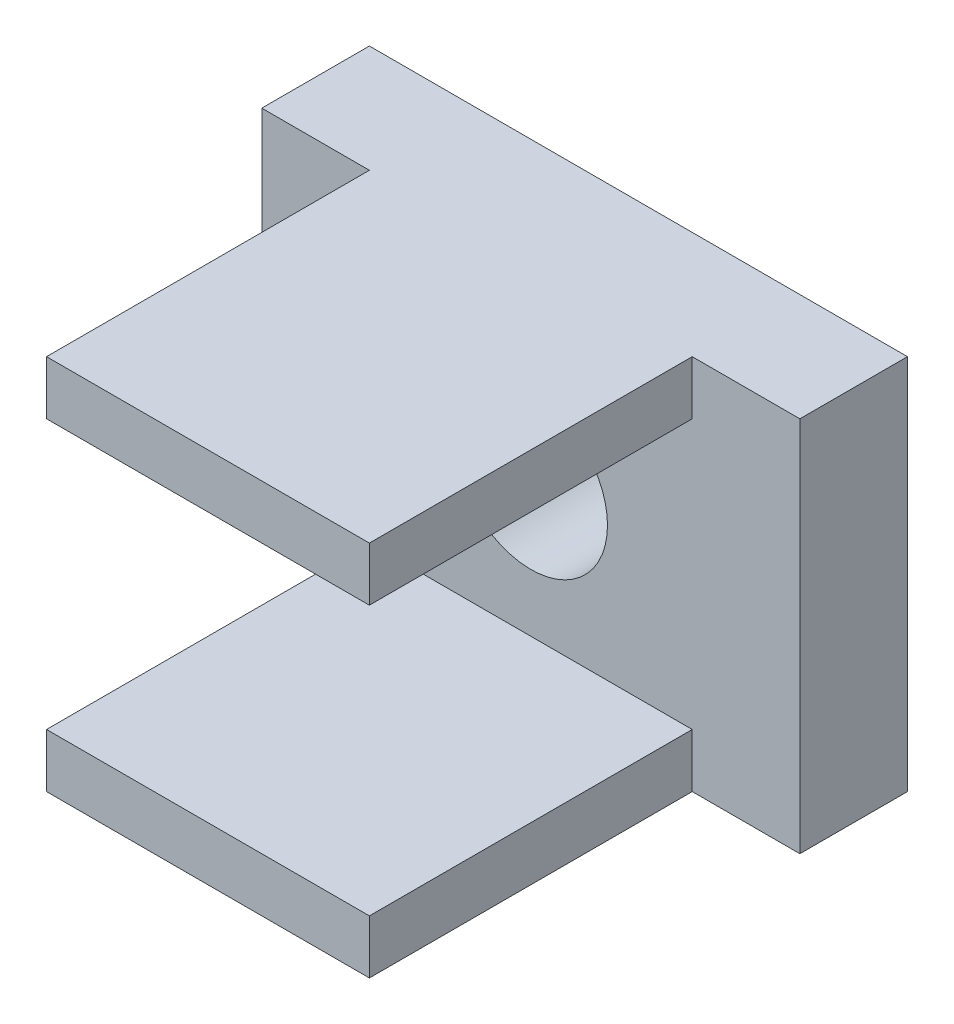
ISO-10303-21;
HEADER;
FILE_DESCRIPTION(('STEP AP214'),'2;1');
FILE_NAME('part.step','',(''),(''),'','','');
FILE_SCHEMA(('AUTOMOTIVE_DESIGN { 1 0 10303 214 1 1 1 1 }'));
ENDSEC;
DATA;
#1=APPLICATION_CONTEXT('core data for automotive mechanical design processes');
#2=APPLICATION_PROTOCOL_DEFINITION('international standard','automotive_design',2000,#1);
#3=PRODUCT_CONTEXT('',#1,'mechanical');
#4=PRODUCT('Part','Part','',(#3));
#5=PRODUCT_RELATED_PRODUCT_CATEGORY('part','',(#4));
#6=PRODUCT_DEFINITION_FORMATION('','',#4);
#7=PRODUCT_DEFINITION_CONTEXT('part definition',#1,'design');
#8=PRODUCT_DEFINITION('design','',#6,#7);
#9=PRODUCT_DEFINITION_SHAPE('','',#8);
#10=(LENGTH_UNIT() NAMED_UNIT(*) SI_UNIT(.MILLI.,.METRE.));
#11=(NAMED_UNIT(*) PLANE_ANGLE_UNIT() SI_UNIT($,.RADIAN.));
#12=(NAMED_UNIT(*) SI_UNIT($,.STERADIAN.) SOLID_ANGLE_UNIT());
#13=UNCERTAINTY_MEASURE_WITH_UNIT(LENGTH_MEASURE(1.E-05),#10,'distance_accuracy_value','');
#14=(GEOMETRIC_REPRESENTATION_CONTEXT(3) GLOBAL_UNCERTAINTY_ASSIGNED_CONTEXT((#13)) GLOBAL_UNIT_ASSIGNED_CONTEXT((#10,
#11,#12)) REPRESENTATION_CONTEXT('',''));
#15=CARTESIAN_POINT('',(0.,0.,0.));
#16=DIRECTION('',(0.,0.,1.));
#17=DIRECTION('',(1.,0.,0.));
#18=AXIS2_PLACEMENT_3D('',#15,#16,#17);
#19=CARTESIAN_POINT('',(0.,0.,2.));
#20=DIRECTION('',(0.,0.,1.));
#21=DIRECTION('',(1.,0.,0.));
#22=AXIS2_PLACEMENT_3D('',#19,#20,#21);
#23=PLANE('',#22);
#24=CARTESIAN_POINT('',(0.,0.,2.));
#25=DIRECTION('',(0.,0.,1.));
#26=DIRECTION('',(1.,0.,0.));
#27=AXIS2_PLACEMENT_3D('',#24,#25,#26);
#28=CIRCLE('',#27,1.425);
#29=CARTESIAN_POINT('',(1.425,0.,2.));
#30=VERTEX_POINT('',#29);
#31=EDGE_CURVE('E412',#30,#30,#28,.T.);
#32=ORIENTED_EDGE('',*,*,#31,.F.);
#33=EDGE_LOOP('',(#32));
#34=FACE_BOUND('',#33,.T.);
#35=DIRECTION('',(1.,0.,0.));
#36=VECTOR('',#35,1.);
#37=CARTESIAN_POINT('',(-5.,-3.5,2.));
#38=LINE('',#37,#36);
#39=CARTESIAN_POINT('',(-5.,-3.5,2.));
#40=VERTEX_POINT('',#39);
#41=CARTESIAN_POINT('',(-3.,-3.5,2.));
#42=VERTEX_POINT('',#41);
#43=EDGE_CURVE('E215',#40,#42,#38,.T.);
#44=ORIENTED_EDGE('',*,*,#43,.T.);
#45=DIRECTION('',(0.,-1.,0.));
#46=VECTOR('',#45,1.);
#47=CARTESIAN_POINT('',(-3.,-3.5,2.));
#48=LINE('',#47,#46);
#49=CARTESIAN_POINT('',(-3.,-2.5,2.));
#50=VERTEX_POINT('',#49);
#51=EDGE_CURVE('E155',#50,#42,#48,.T.);
#52=ORIENTED_EDGE('',*,*,#51,.F.);
#53=DIRECTION('',(-1.,0.,0.));
#54=VECTOR('',#53,1.);
#55=CARTESIAN_POINT('',(-3.,-2.5,2.));
#56=LINE('',#55,#54);
#57=CARTESIAN_POINT('',(3.,-2.5,2.));
#58=VERTEX_POINT('',#57);
#59=EDGE_CURVE('E151',#58,#50,#56,.T.);
#60=ORIENTED_EDGE('',*,*,#59,.F.);
#61=DIRECTION('',(0.,1.,0.));
#62=VECTOR('',#61,1.);
#63=CARTESIAN_POINT('',(3.,-3.5,2.));
#64=LINE('',#63,#62);
#65=CARTESIAN_POINT('',(3.,-3.5,2.));
#66=VERTEX_POINT('',#65);
#67=EDGE_CURVE('E256',#66,#58,#64,.T.);
#68=ORIENTED_EDGE('',*,*,#67,.F.);
#69=CARTESIAN_POINT('',(5.,-3.5,2.));
#70=VERTEX_POINT('',#69);
#71=EDGE_CURVE('E214',#66,#70,#38,.T.);
#72=ORIENTED_EDGE('',*,*,#71,.T.);
#73=DIRECTION('',(0.,1.,0.));
#74=VECTOR('',#73,1.);
#75=CARTESIAN_POINT('',(5.,3.5,2.));
#76=LINE('',#75,#74);
#77=CARTESIAN_POINT('',(5.,3.5,2.));
#78=VERTEX_POINT('',#77);
#79=EDGE_CURVE('E202',#70,#78,#76,.T.);
#80=ORIENTED_EDGE('',*,*,#79,.T.);
#81=DIRECTION('',(-1.,0.,0.));
#82=VECTOR('',#81,1.);
#83=CARTESIAN_POINT('',(-5.,3.5,2.));
#84=LINE('',#83,#82);
#85=CARTESIAN_POINT('',(3.,3.5,2.));
#86=VERTEX_POINT('',#85);
#87=EDGE_CURVE('E208',#78,#86,#84,.T.);
#88=ORIENTED_EDGE('',*,*,#87,.T.);
#89=DIRECTION('',(0.,1.,0.));
#90=VECTOR('',#89,1.);
#91=CARTESIAN_POINT('',(3.,3.5,2.));
#92=LINE('',#91,#90);
#93=CARTESIAN_POINT('',(3.,2.5,2.));
#94=VERTEX_POINT('',#93);
#95=EDGE_CURVE('E172',#94,#86,#92,.T.);
#96=ORIENTED_EDGE('',*,*,#95,.F.);
#97=DIRECTION('',(1.,0.,0.));
#98=VECTOR('',#97,1.);
#99=CARTESIAN_POINT('',(-3.,2.5,2.));
#100=LINE('',#99,#98);
#101=CARTESIAN_POINT('',(-3.,2.5,2.));
#102=VERTEX_POINT('',#101);
#103=EDGE_CURVE('E63',#102,#94,#100,.T.);
#104=ORIENTED_EDGE('',*,*,#103,.F.);
#105=DIRECTION('',(0.,-1.,0.));
#106=VECTOR('',#105,1.);
#107=CARTESIAN_POINT('',(-3.,3.5,2.));
#108=LINE('',#107,#106);
#109=CARTESIAN_POINT('',(-3.,3.5,2.));
#110=VERTEX_POINT('',#109);
#111=EDGE_CURVE('E158',#110,#102,#108,.T.);
#112=ORIENTED_EDGE('',*,*,#111,.F.);
#113=CARTESIAN_POINT('',(-5.,3.5,2.));
#114=VERTEX_POINT('',#113);
#115=EDGE_CURVE('E206',#110,#114,#84,.T.);
#116=ORIENTED_EDGE('',*,*,#115,.T.);
#117=DIRECTION('',(0.,-1.,0.));
#118=VECTOR('',#117,1.);
#119=CARTESIAN_POINT('',(-5.,3.5,2.));
#120=LINE('',#119,#118);
#121=EDGE_CURVE('E211',#114,#40,#120,.T.);
#122=ORIENTED_EDGE('',*,*,#121,.T.);
#123=EDGE_LOOP('',(#44,#52,#60,#68,#72,#80,#88,#96,#104,#112,#116,#122));
#124=FACE_BOUND('',#123,.T.);
#125=ADVANCED_FACE('F39',(#34,#124),#23,.T.);
#126=CARTESIAN_POINT('',(5.,3.5,2.));
#127=DIRECTION('',(-1.,0.,0.));
#128=DIRECTION('',(0.,-1.,0.));
#129=AXIS2_PLACEMENT_3D('',#126,#127,#128);
#130=PLANE('',#129);
#131=DIRECTION('',(0.,1.,0.));
#132=VECTOR('',#131,1.);
#133=CARTESIAN_POINT('',(5.,3.5,0.));
#134=LINE('',#133,#132);
#135=CARTESIAN_POINT('',(5.,-3.5,0.));
#136=VERTEX_POINT('',#135);
#137=CARTESIAN_POINT('',(5.,3.5,0.));
#138=VERTEX_POINT('',#137);
#139=EDGE_CURVE('E201',#136,#138,#134,.T.);
#140=ORIENTED_EDGE('',*,*,#139,.T.);
#141=DIRECTION('',(0.,0.,-1.));
#142=VECTOR('',#141,1.);
#143=CARTESIAN_POINT('',(5.,3.5,2.));
#144=LINE('',#143,#142);
#145=EDGE_CURVE('E11',#78,#138,#144,.T.);
#146=ORIENTED_EDGE('',*,*,#145,.F.);
#147=ORIENTED_EDGE('',*,*,#79,.F.);
#148=DIRECTION('',(0.,0.,-1.));
#149=VECTOR('',#148,1.);
#150=CARTESIAN_POINT('',(5.,-3.5,2.));
#151=LINE('',#150,#149);
#152=EDGE_CURVE('E218',#70,#136,#151,.T.);
#153=ORIENTED_EDGE('',*,*,#152,.T.);
#154=EDGE_LOOP('',(#140,#146,#147,#153));
#155=FACE_BOUND('',#154,.T.);
#156=ADVANCED_FACE('F41',(#155),#130,.F.);
#157=CARTESIAN_POINT('',(-5.,3.5,2.));
#158=DIRECTION('',(0.,-1.,0.));
#159=DIRECTION('',(0.,0.,-1.));
#160=AXIS2_PLACEMENT_3D('',#157,#158,#159);
#161=PLANE('',#160);
#162=DIRECTION('',(-1.,0.,0.));
#163=VECTOR('',#162,1.);
#164=CARTESIAN_POINT('',(-5.,3.5,0.));
#165=LINE('',#164,#163);
#166=CARTESIAN_POINT('',(-5.,3.5,0.));
#167=VERTEX_POINT('',#166);
#168=EDGE_CURVE('E222',#138,#167,#165,.T.);
#169=ORIENTED_EDGE('',*,*,#168,.T.);
#170=DIRECTION('',(0.,0.,-1.));
#171=VECTOR('',#170,1.);
#172=CARTESIAN_POINT('',(-5.,3.5,2.));
#173=LINE('',#172,#171);
#174=EDGE_CURVE('E48',#114,#167,#173,.T.);
#175=ORIENTED_EDGE('',*,*,#174,.F.);
#176=ORIENTED_EDGE('',*,*,#115,.F.);
#177=DIRECTION('',(0.,0.,-1.));
#178=VECTOR('',#177,1.);
#179=CARTESIAN_POINT('',(-3.,3.5,8.));
#180=LINE('',#179,#178);
#181=CARTESIAN_POINT('',(-3.,3.5,8.));
#182=VERTEX_POINT('',#181);
#183=EDGE_CURVE('E180',#182,#110,#180,.T.);
#184=ORIENTED_EDGE('',*,*,#183,.F.);
#185=DIRECTION('',(-1.,0.,0.));
#186=VECTOR('',#185,1.);
#187=CARTESIAN_POINT('',(-3.,3.5,8.));
#188=LINE('',#187,#186);
#189=CARTESIAN_POINT('',(3.,3.5,8.));
#190=VERTEX_POINT('',#189);
#191=EDGE_CURVE('E178',#190,#182,#188,.T.);
#192=ORIENTED_EDGE('',*,*,#191,.F.);
#193=DIRECTION('',(0.,0.,-1.));
#194=VECTOR('',#193,1.);
#195=CARTESIAN_POINT('',(3.,3.5,8.));
#196=LINE('',#195,#194);
#197=EDGE_CURVE('E190',#190,#86,#196,.T.);
#198=ORIENTED_EDGE('',*,*,#197,.T.);
#199=ORIENTED_EDGE('',*,*,#87,.F.);
#200=ORIENTED_EDGE('',*,*,#145,.T.);
#201=EDGE_LOOP('',(#169,#175,#176,#184,#192,#198,#199,#200));
#202=FACE_BOUND('',#201,.T.);
#203=ADVANCED_FACE('F260',(#202),#161,.F.);
#204=CARTESIAN_POINT('',(-5.,3.5,2.));
#205=DIRECTION('',(1.,0.,0.));
#206=DIRECTION('',(0.,1.,0.));
#207=AXIS2_PLACEMENT_3D('',#204,#205,#206);
#208=PLANE('',#207);
#209=DIRECTION('',(0.,-1.,0.));
#210=VECTOR('',#209,1.);
#211=CARTESIAN_POINT('',(-5.,3.5,0.));
#212=LINE('',#211,#210);
#213=CARTESIAN_POINT('',(-5.,-3.5,0.));
#214=VERTEX_POINT('',#213);
#215=EDGE_CURVE('E225',#167,#214,#212,.T.);
#216=ORIENTED_EDGE('',*,*,#215,.T.);
#217=DIRECTION('',(0.,0.,-1.));
#218=VECTOR('',#217,1.);
#219=CARTESIAN_POINT('',(-5.,-3.5,2.));
#220=LINE('',#219,#218);
#221=EDGE_CURVE('E233',#40,#214,#220,.T.);
#222=ORIENTED_EDGE('',*,*,#221,.F.);
#223=ORIENTED_EDGE('',*,*,#121,.F.);
#224=ORIENTED_EDGE('',*,*,#174,.T.);
#225=EDGE_LOOP('',(#216,#222,#223,#224));
#226=FACE_BOUND('',#225,.T.);
#227=ADVANCED_FACE('F242',(#226),#208,.F.);
#228=CARTESIAN_POINT('',(-5.,-3.5,2.));
#229=DIRECTION('',(0.,1.,0.));
#230=DIRECTION('',(0.,0.,1.));
#231=AXIS2_PLACEMENT_3D('',#228,#229,#230);
#232=PLANE('',#231);
#233=DIRECTION('',(1.,0.,0.));
#234=VECTOR('',#233,1.);
#235=CARTESIAN_POINT('',(-5.,-3.5,0.));
#236=LINE('',#235,#234);
#237=EDGE_CURVE('E207',#214,#136,#236,.T.);
#238=ORIENTED_EDGE('',*,*,#237,.T.);
#239=ORIENTED_EDGE('',*,*,#152,.F.);
#240=ORIENTED_EDGE('',*,*,#71,.F.);
#241=DIRECTION('',(0.,0.,-1.));
#242=VECTOR('',#241,1.);
#243=CARTESIAN_POINT('',(3.,-3.5,8.));
#244=LINE('',#243,#242);
#245=CARTESIAN_POINT('',(3.,-3.5,8.));
#246=VERTEX_POINT('',#245);
#247=EDGE_CURVE('E137',#246,#66,#244,.T.);
#248=ORIENTED_EDGE('',*,*,#247,.F.);
#249=DIRECTION('',(1.,0.,0.));
#250=VECTOR('',#249,1.);
#251=CARTESIAN_POINT('',(-3.,-3.5,8.));
#252=LINE('',#251,#250);
#253=CARTESIAN_POINT('',(-3.,-3.5,8.));
#254=VERTEX_POINT('',#253);
#255=EDGE_CURVE('E129',#254,#246,#252,.T.);
#256=ORIENTED_EDGE('',*,*,#255,.F.);
#257=DIRECTION('',(0.,0.,-1.));
#258=VECTOR('',#257,1.);
#259=CARTESIAN_POINT('',(-3.,-3.5,8.));
#260=LINE('',#259,#258);
#261=EDGE_CURVE('E134',#254,#42,#260,.T.);
#262=ORIENTED_EDGE('',*,*,#261,.T.);
#263=ORIENTED_EDGE('',*,*,#43,.F.);
#264=ORIENTED_EDGE('',*,*,#221,.T.);
#265=EDGE_LOOP('',(#238,#239,#240,#248,#256,#262,#263,#264));
#266=FACE_BOUND('',#265,.T.);
#267=ADVANCED_FACE('F131',(#266),#232,.F.);
#268=CARTESIAN_POINT('',(0.,0.,0.));
#269=DIRECTION('',(0.,0.,1.));
#270=DIRECTION('',(1.,0.,0.));
#271=AXIS2_PLACEMENT_3D('',#268,#269,#270);
#272=PLANE('',#271);
#273=CARTESIAN_POINT('',(0.,0.,0.));
#274=DIRECTION('',(0.,0.,1.));
#275=DIRECTION('',(1.,0.,0.));
#276=AXIS2_PLACEMENT_3D('',#273,#274,#275);
#277=CIRCLE('',#276,1.425);
#278=CARTESIAN_POINT('',(1.425,0.,0.));
#279=VERTEX_POINT('',#278);
#280=EDGE_CURVE('E410',#279,#279,#277,.T.);
#281=ORIENTED_EDGE('',*,*,#280,.T.);
#282=EDGE_LOOP('',(#281));
#283=FACE_BOUND('',#282,.T.);
#284=ORIENTED_EDGE('',*,*,#139,.F.);
#285=ORIENTED_EDGE('',*,*,#237,.F.);
#286=ORIENTED_EDGE('',*,*,#215,.F.);
#287=ORIENTED_EDGE('',*,*,#168,.F.);
#288=EDGE_LOOP('',(#284,#285,#286,#287));
#289=FACE_BOUND('',#288,.T.);
#290=ADVANCED_FACE('F249',(#283,#289),#272,.F.);
#291=CARTESIAN_POINT('',(-3.,3.5,8.));
#292=DIRECTION('',(1.,0.,0.));
#293=DIRECTION('',(0.,1.,0.));
#294=AXIS2_PLACEMENT_3D('',#291,#292,#293);
#295=PLANE('',#294);
#296=ORIENTED_EDGE('',*,*,#111,.T.);
#297=DIRECTION('',(0.,0.,-1.));
#298=VECTOR('',#297,1.);
#299=CARTESIAN_POINT('',(-3.,2.5,8.));
#300=LINE('',#299,#298);
#301=CARTESIAN_POINT('',(-3.,2.5,8.));
#302=VERTEX_POINT('',#301);
#303=EDGE_CURVE('E198',#302,#102,#300,.T.);
#304=ORIENTED_EDGE('',*,*,#303,.F.);
#305=DIRECTION('',(0.,-1.,0.));
#306=VECTOR('',#305,1.);
#307=CARTESIAN_POINT('',(-3.,3.5,8.));
#308=LINE('',#307,#306);
#309=EDGE_CURVE('E167',#182,#302,#308,.T.);
#310=ORIENTED_EDGE('',*,*,#309,.F.);
#311=ORIENTED_EDGE('',*,*,#183,.T.);
#312=EDGE_LOOP('',(#296,#304,#310,#311));
#313=FACE_BOUND('',#312,.T.);
#314=ADVANCED_FACE('F264',(#313),#295,.F.);
#315=CARTESIAN_POINT('',(-3.,2.5,8.));
#316=DIRECTION('',(0.,1.,0.));
#317=DIRECTION('',(0.,0.,1.));
#318=AXIS2_PLACEMENT_3D('',#315,#316,#317);
#319=PLANE('',#318);
#320=ORIENTED_EDGE('',*,*,#103,.T.);
#321=DIRECTION('',(0.,0.,-1.));
#322=VECTOR('',#321,1.);
#323=CARTESIAN_POINT('',(3.,2.5,8.));
#324=LINE('',#323,#322);
#325=CARTESIAN_POINT('',(3.,2.5,8.));
#326=VERTEX_POINT('',#325);
#327=EDGE_CURVE('E194',#326,#94,#324,.T.);
#328=ORIENTED_EDGE('',*,*,#327,.F.);
#329=DIRECTION('',(1.,0.,0.));
#330=VECTOR('',#329,1.);
#331=CARTESIAN_POINT('',(-3.,2.5,8.));
#332=LINE('',#331,#330);
#333=EDGE_CURVE('E171',#302,#326,#332,.T.);
#334=ORIENTED_EDGE('',*,*,#333,.F.);
#335=ORIENTED_EDGE('',*,*,#303,.T.);
#336=EDGE_LOOP('',(#320,#328,#334,#335));
#337=FACE_BOUND('',#336,.T.);
#338=ADVANCED_FACE('F274',(#337),#319,.F.);
#339=CARTESIAN_POINT('',(3.,3.5,8.));
#340=DIRECTION('',(-1.,0.,0.));
#341=DIRECTION('',(0.,-1.,0.));
#342=AXIS2_PLACEMENT_3D('',#339,#340,#341);
#343=PLANE('',#342);
#344=ORIENTED_EDGE('',*,*,#95,.T.);
#345=ORIENTED_EDGE('',*,*,#197,.F.);
#346=DIRECTION('',(0.,1.,0.));
#347=VECTOR('',#346,1.);
#348=CARTESIAN_POINT('',(3.,3.5,8.));
#349=LINE('',#348,#347);
#350=EDGE_CURVE('E175',#326,#190,#349,.T.);
#351=ORIENTED_EDGE('',*,*,#350,.F.);
#352=ORIENTED_EDGE('',*,*,#327,.T.);
#353=EDGE_LOOP('',(#344,#345,#351,#352));
#354=FACE_BOUND('',#353,.T.);
#355=ADVANCED_FACE('F272',(#354),#343,.F.);
#356=CARTESIAN_POINT('',(0.,0.,8.));
#357=DIRECTION('',(0.,0.,1.));
#358=DIRECTION('',(1.,0.,0.));
#359=AXIS2_PLACEMENT_3D('',#356,#357,#358);
#360=PLANE('',#359);
#361=ORIENTED_EDGE('',*,*,#309,.T.);
#362=ORIENTED_EDGE('',*,*,#333,.T.);
#363=ORIENTED_EDGE('',*,*,#350,.T.);
#364=ORIENTED_EDGE('',*,*,#191,.T.);
#365=EDGE_LOOP('',(#361,#362,#363,#364));
#366=FACE_BOUND('',#365,.T.);
#367=ADVANCED_FACE('F267',(#366),#360,.T.);
#368=CARTESIAN_POINT('',(-3.,-3.5,8.));
#369=DIRECTION('',(1.,0.,0.));
#370=DIRECTION('',(0.,1.,0.));
#371=AXIS2_PLACEMENT_3D('',#368,#369,#370);
#372=PLANE('',#371);
#373=ORIENTED_EDGE('',*,*,#51,.T.);
#374=ORIENTED_EDGE('',*,*,#261,.F.);
#375=DIRECTION('',(0.,-1.,0.));
#376=VECTOR('',#375,1.);
#377=CARTESIAN_POINT('',(-3.,-3.5,8.));
#378=LINE('',#377,#376);
#379=CARTESIAN_POINT('',(-3.,-2.5,8.));
#380=VERTEX_POINT('',#379);
#381=EDGE_CURVE('E142',#380,#254,#378,.T.);
#382=ORIENTED_EDGE('',*,*,#381,.F.);
#383=DIRECTION('',(0.,0.,-1.));
#384=VECTOR('',#383,1.);
#385=CARTESIAN_POINT('',(-3.,-2.5,8.));
#386=LINE('',#385,#384);
#387=EDGE_CURVE('E422',#380,#50,#386,.T.);
#388=ORIENTED_EDGE('',*,*,#387,.T.);
#389=EDGE_LOOP('',(#373,#374,#382,#388));
#390=FACE_BOUND('',#389,.T.);
#391=ADVANCED_FACE('F153',(#390),#372,.F.);
#392=CARTESIAN_POINT('',(3.,-3.5,8.));
#393=DIRECTION('',(-1.,0.,0.));
#394=DIRECTION('',(0.,-1.,0.));
#395=AXIS2_PLACEMENT_3D('',#392,#393,#394);
#396=PLANE('',#395);
#397=ORIENTED_EDGE('',*,*,#67,.T.);
#398=DIRECTION('',(0.,0.,-1.));
#399=VECTOR('',#398,1.);
#400=CARTESIAN_POINT('',(3.,-2.5,8.));
#401=LINE('',#400,#399);
#402=CARTESIAN_POINT('',(3.,-2.5,8.));
#403=VERTEX_POINT('',#402);
#404=EDGE_CURVE('E55',#403,#58,#401,.T.);
#405=ORIENTED_EDGE('',*,*,#404,.F.);
#406=DIRECTION('',(0.,1.,0.));
#407=VECTOR('',#406,1.);
#408=CARTESIAN_POINT('',(3.,-3.5,8.));
#409=LINE('',#408,#407);
#410=EDGE_CURVE('E141',#246,#403,#409,.T.);
#411=ORIENTED_EDGE('',*,*,#410,.F.);
#412=ORIENTED_EDGE('',*,*,#247,.T.);
#413=EDGE_LOOP('',(#397,#405,#411,#412));
#414=FACE_BOUND('',#413,.T.);
#415=ADVANCED_FACE('F340',(#414),#396,.F.);
#416=CARTESIAN_POINT('',(-3.,-2.5,8.));
#417=DIRECTION('',(0.,-1.,0.));
#418=DIRECTION('',(0.,0.,-1.));
#419=AXIS2_PLACEMENT_3D('',#416,#417,#418);
#420=PLANE('',#419);
#421=ORIENTED_EDGE('',*,*,#59,.T.);
#422=ORIENTED_EDGE('',*,*,#387,.F.);
#423=DIRECTION('',(-1.,0.,0.));
#424=VECTOR('',#423,1.);
#425=CARTESIAN_POINT('',(-3.,-2.5,8.));
#426=LINE('',#425,#424);
#427=EDGE_CURVE('E146',#403,#380,#426,.T.);
#428=ORIENTED_EDGE('',*,*,#427,.F.);
#429=ORIENTED_EDGE('',*,*,#404,.T.);
#430=EDGE_LOOP('',(#421,#422,#428,#429));
#431=FACE_BOUND('',#430,.T.);
#432=ADVANCED_FACE('F349',(#431),#420,.F.);
#433=CARTESIAN_POINT('',(0.,0.,8.));
#434=DIRECTION('',(0.,0.,-1.));
#435=DIRECTION('',(-1.,0.,0.));
#436=AXIS2_PLACEMENT_3D('',#433,#434,#435);
#437=PLANE('',#436);
#438=ORIENTED_EDGE('',*,*,#381,.T.);
#439=ORIENTED_EDGE('',*,*,#255,.T.);
#440=ORIENTED_EDGE('',*,*,#410,.T.);
#441=ORIENTED_EDGE('',*,*,#427,.T.);
#442=EDGE_LOOP('',(#438,#439,#440,#441));
#443=FACE_BOUND('',#442,.T.);
#444=ADVANCED_FACE('F145',(#443),#437,.F.);
#445=CARTESIAN_POINT('',(0.,0.,0.));
#446=DIRECTION('',(0.,0.,1.));
#447=DIRECTION('',(1.,0.,0.));
#448=AXIS2_PLACEMENT_3D('',#445,#446,#447);
#449=CYLINDRICAL_SURFACE('',#448,1.425);
#450=ORIENTED_EDGE('',*,*,#280,.F.);
#451=EDGE_LOOP('',(#450));
#452=FACE_BOUND('',#451,.T.);
#453=ORIENTED_EDGE('',*,*,#31,.T.);
#454=EDGE_LOOP('',(#453));
#455=FACE_BOUND('',#454,.T.);
#456=ADVANCED_FACE('F365',(#452,#455),#449,.F.);
#457=CLOSED_SHELL('',(#125,#156,#203,#227,#267,#290,#314,#338,#355,#367,#391,#415,#432,#444,#456));
#458=MANIFOLD_SOLID_BREP('B2',#457);
#459=ADVANCED_BREP_SHAPE_REPRESENTATION('',(#18,#458),#14);
#460=SHAPE_DEFINITION_REPRESENTATION(#9,#459);
ENDSEC;
END-ISO-10303-21;
